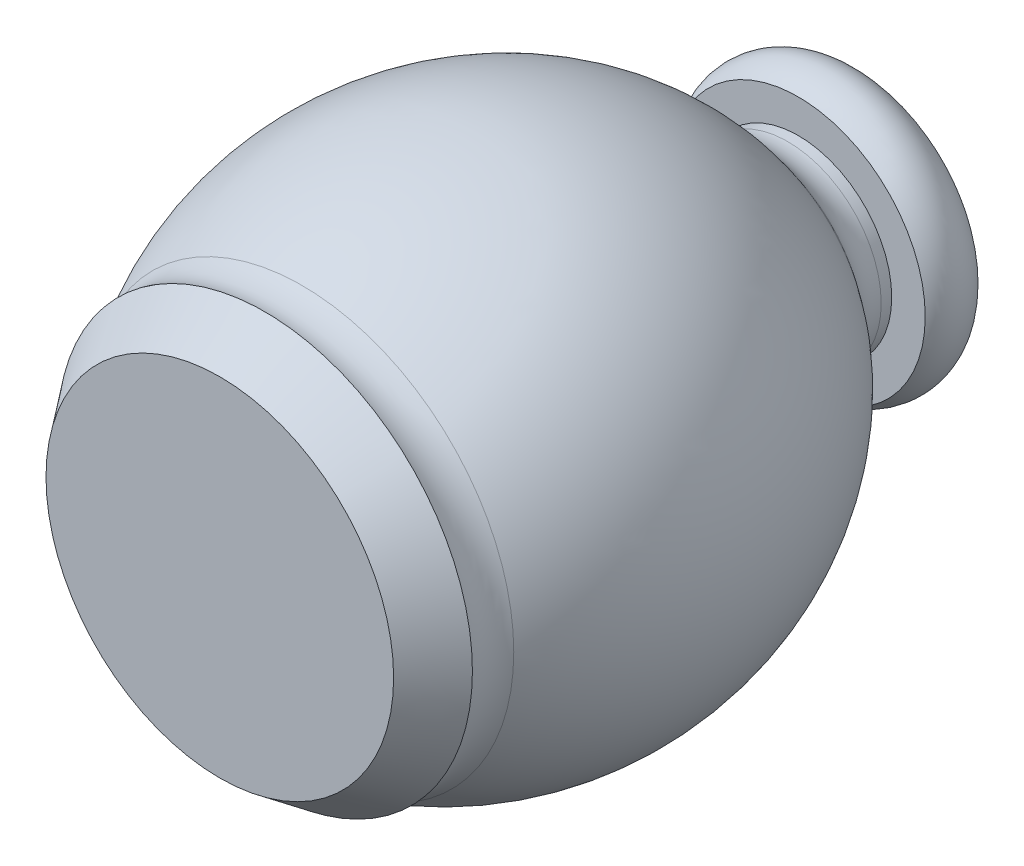
ISO-10303-21;
HEADER;
FILE_DESCRIPTION(('STEP AP214'),'2;1');
FILE_NAME('part.step','',(''),(''),'','','');
FILE_SCHEMA(('AUTOMOTIVE_DESIGN { 1 0 10303 214 1 1 1 1 }'));
ENDSEC;
DATA;
#1=APPLICATION_CONTEXT('core data for automotive mechanical design processes');
#2=APPLICATION_PROTOCOL_DEFINITION('international standard','automotive_design',2000,#1);
#3=PRODUCT_CONTEXT('',#1,'mechanical');
#4=PRODUCT('Part','Part','',(#3));
#5=PRODUCT_RELATED_PRODUCT_CATEGORY('part','',(#4));
#6=PRODUCT_DEFINITION_FORMATION('','',#4);
#7=PRODUCT_DEFINITION_CONTEXT('part definition',#1,'design');
#8=PRODUCT_DEFINITION('design','',#6,#7);
#9=PRODUCT_DEFINITION_SHAPE('','',#8);
#10=(LENGTH_UNIT() NAMED_UNIT(*) SI_UNIT(.MILLI.,.METRE.));
#11=(NAMED_UNIT(*) PLANE_ANGLE_UNIT() SI_UNIT($,.RADIAN.));
#12=(NAMED_UNIT(*) SI_UNIT($,.STERADIAN.) SOLID_ANGLE_UNIT());
#13=UNCERTAINTY_MEASURE_WITH_UNIT(LENGTH_MEASURE(1.E-05),#10,'distance_accuracy_value','');
#14=(GEOMETRIC_REPRESENTATION_CONTEXT(3) GLOBAL_UNCERTAINTY_ASSIGNED_CONTEXT((#13)) GLOBAL_UNIT_ASSIGNED_CONTEXT((#10,
#11,#12)) REPRESENTATION_CONTEXT('',''));
#15=CARTESIAN_POINT('',(0.,0.,0.));
#16=DIRECTION('',(0.,0.,1.));
#17=DIRECTION('',(1.,0.,0.));
#18=AXIS2_PLACEMENT_3D('',#15,#16,#17);
#19=CARTESIAN_POINT('',(0.,0.,3.));
#20=DIRECTION('',(0.,0.,-1.));
#21=DIRECTION('',(-1.,0.,0.));
#22=AXIS2_PLACEMENT_3D('',#19,#20,#21);
#23=PLANE('',#22);
#24=CARTESIAN_POINT('',(0.,0.,3.));
#25=DIRECTION('',(0.,0.,1.));
#26=DIRECTION('',(1.,0.,0.));
#27=AXIS2_PLACEMENT_3D('',#24,#25,#26);
#28=CIRCLE('',#27,27.6768988149161);
#29=CARTESIAN_POINT('',(27.6768988149161,0.,3.));
#30=VERTEX_POINT('',#29);
#31=EDGE_CURVE('E10',#30,#30,#28,.T.);
#32=ORIENTED_EDGE('',*,*,#31,.T.);
#33=EDGE_LOOP('',(#32));
#34=FACE_BOUND('',#33,.T.);
#35=ADVANCED_FACE('F40',(#34),#23,.F.);
#36=CARTESIAN_POINT('',(0.,0.,-4.17951570845209));
#37=DIRECTION('',(0.,0.,-1.));
#38=DIRECTION('',(-1.,0.,0.));
#39=AXIS2_PLACEMENT_3D('',#36,#37,#38);
#40=CONICAL_SURFACE('',#39,33.0441095872541,0.641945900093793);
#41=ORIENTED_EDGE('',*,*,#31,.F.);
#42=EDGE_LOOP('',(#41));
#43=FACE_BOUND('',#42,.T.);
#44=CARTESIAN_POINT('',(0.,0.,-4.17951570845209));
#45=DIRECTION('',(0.,0.,1.));
#46=DIRECTION('',(1.,0.,0.));
#47=AXIS2_PLACEMENT_3D('',#44,#45,#46);
#48=CIRCLE('',#47,33.0441095872541);
#49=CARTESIAN_POINT('',(33.0441095872541,0.,-4.17951570845209));
#50=VERTEX_POINT('',#49);
#51=EDGE_CURVE('E43',#50,#50,#48,.T.);
#52=ORIENTED_EDGE('',*,*,#51,.T.);
#53=EDGE_LOOP('',(#52));
#54=FACE_BOUND('',#53,.T.);
#55=ADVANCED_FACE('F119',(#43,#54),#40,.T.);
#56=CARTESIAN_POINT('',(0.,0.,-6.44152268149266));
#57=DIRECTION('',(0.,0.,1.));
#58=DIRECTION('',(1.,0.,0.));
#59=AXIS2_PLACEMENT_3D('',#56,#57,#58);
#60=TOROIDAL_SURFACE('',#59,39.66855857973,7.);
#61=ORIENTED_EDGE('',*,*,#51,.F.);
#62=EDGE_LOOP('',(#61));
#63=FACE_BOUND('',#62,.T.);
#64=CARTESIAN_POINT('',(0.,0.,-10.103549391567));
#65=DIRECTION('',(0.,0.,1.));
#66=DIRECTION('',(1.,0.,0.));
#67=AXIS2_PLACEMENT_3D('',#64,#65,#66);
#68=CIRCLE('',#67,33.702859930393);
#69=CARTESIAN_POINT('',(33.702859930393,0.,-10.103549391567));
#70=VERTEX_POINT('',#69);
#71=EDGE_CURVE('E50',#70,#70,#68,.T.);
#72=ORIENTED_EDGE('',*,*,#71,.T.);
#73=EDGE_LOOP('',(#72));
#74=FACE_BOUND('',#73,.T.);
#75=ADVANCED_FACE('F123',(#63,#74),#60,.F.);
#76=CARTESIAN_POINT('',(0.,0.,-37.656976744186));
#77=DIRECTION('',(0.,0.,1.));
#78=DIRECTION('',(1.,0.,0.));
#79=AXIS2_PLACEMENT_3D('',#76,#77,#78);
#80=DEGENERATE_TOROIDAL_SURFACE('',#79,11.1836079618059,52.668646828198,.F.);
#81=ORIENTED_EDGE('',*,*,#71,.F.);
#82=EDGE_LOOP('',(#81));
#83=FACE_BOUND('',#82,.T.);
#84=CARTESIAN_POINT('',(0.,0.,-79.840989674269));
#85=DIRECTION('',(0.,0.,1.));
#86=DIRECTION('',(1.,0.,0.));
#87=AXIS2_PLACEMENT_3D('',#84,#85,#86);
#88=CIRCLE('',#87,20.3520133548583);
#89=CARTESIAN_POINT('',(20.3520133548583,0.,-79.840989674269));
#90=VERTEX_POINT('',#89);
#91=EDGE_CURVE('E51',#90,#90,#88,.T.);
#92=ORIENTED_EDGE('',*,*,#91,.T.);
#93=EDGE_LOOP('',(#92));
#94=FACE_BOUND('',#93,.T.);
#95=ADVANCED_FACE('F128',(#83,#94),#80,.F.);
#96=CARTESIAN_POINT('',(0.,0.,-81.835114974885));
#97=DIRECTION('',(0.,0.,1.));
#98=DIRECTION('',(1.,0.,0.));
#99=AXIS2_PLACEMENT_3D('',#96,#97,#98);
#100=CONICAL_SURFACE('',#99,17.6845470436447,0.928850426701103);
#101=ORIENTED_EDGE('',*,*,#91,.F.);
#102=EDGE_LOOP('',(#101));
#103=FACE_BOUND('',#102,.T.);
#104=CARTESIAN_POINT('',(0.,0.,-81.835114974885));
#105=DIRECTION('',(0.,0.,1.));
#106=DIRECTION('',(1.,0.,0.));
#107=AXIS2_PLACEMENT_3D('',#104,#105,#106);
#108=CIRCLE('',#107,17.6845470436447);
#109=CARTESIAN_POINT('',(17.6845470436447,0.,-81.835114974885));
#110=VERTEX_POINT('',#109);
#111=EDGE_CURVE('E57',#110,#110,#108,.T.);
#112=ORIENTED_EDGE('',*,*,#111,.T.);
#113=EDGE_LOOP('',(#112));
#114=FACE_BOUND('',#113,.T.);
#115=ADVANCED_FACE('F135',(#103,#114),#100,.T.);
#116=CARTESIAN_POINT('',(0.,0.,-87.4416400765037));
#117=DIRECTION('',(0.,0.,1.));
#118=DIRECTION('',(1.,0.,0.));
#119=AXIS2_PLACEMENT_3D('',#116,#117,#118);
#120=TOROIDAL_SURFACE('',#119,21.8758327992237,7.);
#121=ORIENTED_EDGE('',*,*,#111,.F.);
#122=EDGE_LOOP('',(#121));
#123=FACE_BOUND('',#122,.T.);
#124=CARTESIAN_POINT('',(0.,0.,-87.4416400765037));
#125=DIRECTION('',(0.,0.,1.));
#126=DIRECTION('',(1.,0.,0.));
#127=AXIS2_PLACEMENT_3D('',#124,#125,#126);
#128=CIRCLE('',#127,14.8758327992237);
#129=CARTESIAN_POINT('',(14.8758327992237,0.,-87.4416400765037));
#130=VERTEX_POINT('',#129);
#131=EDGE_CURVE('E56',#130,#130,#128,.T.);
#132=ORIENTED_EDGE('',*,*,#131,.T.);
#133=EDGE_LOOP('',(#132));
#134=FACE_BOUND('',#133,.T.);
#135=ADVANCED_FACE('F136',(#123,#134),#120,.F.);
#136=CARTESIAN_POINT('',(0.,0.,0.));
#137=DIRECTION('',(0.,0.,1.));
#138=DIRECTION('',(1.,0.,0.));
#139=AXIS2_PLACEMENT_3D('',#136,#137,#138);
#140=CYLINDRICAL_SURFACE('',#139,14.8758327992237);
#141=ORIENTED_EDGE('',*,*,#131,.F.);
#142=EDGE_LOOP('',(#141));
#143=FACE_BOUND('',#142,.T.);
#144=CARTESIAN_POINT('',(0.,0.,-89.1147582449976));
#145=DIRECTION('',(0.,0.,1.));
#146=DIRECTION('',(1.,0.,0.));
#147=AXIS2_PLACEMENT_3D('',#144,#145,#146);
#148=CIRCLE('',#147,14.8758327992237);
#149=CARTESIAN_POINT('',(14.8758327992237,0.,-89.1147582449976));
#150=VERTEX_POINT('',#149);
#151=EDGE_CURVE('E64',#150,#150,#148,.T.);
#152=ORIENTED_EDGE('',*,*,#151,.T.);
#153=EDGE_LOOP('',(#152));
#154=FACE_BOUND('',#153,.T.);
#155=ADVANCED_FACE('F139',(#143,#154),#140,.T.);
#156=CARTESIAN_POINT('',(-14.8758327992237,0.,-89.1147582449976));
#157=DIRECTION('',(0.,0.,-1.));
#158=DIRECTION('',(-1.,0.,0.));
#159=AXIS2_PLACEMENT_3D('',#156,#157,#158);
#160=PLANE('',#159);
#161=ORIENTED_EDGE('',*,*,#151,.F.);
#162=EDGE_LOOP('',(#161));
#163=FACE_BOUND('',#162,.T.);
#164=CARTESIAN_POINT('',(0.,0.,-89.1147582449976));
#165=DIRECTION('',(0.,0.,1.));
#166=DIRECTION('',(1.,0.,0.));
#167=AXIS2_PLACEMENT_3D('',#164,#165,#166);
#168=CIRCLE('',#167,20.2103123042954);
#169=CARTESIAN_POINT('',(20.2103123042954,0.,-89.1147582449976));
#170=VERTEX_POINT('',#169);
#171=EDGE_CURVE('E63',#170,#170,#168,.T.);
#172=ORIENTED_EDGE('',*,*,#171,.T.);
#173=EDGE_LOOP('',(#172));
#174=FACE_BOUND('',#173,.T.);
#175=ADVANCED_FACE('F143',(#163,#174),#160,.F.);
#176=CARTESIAN_POINT('',(0.,0.,-93.3080900236724));
#177=DIRECTION('',(0.,0.,1.));
#178=DIRECTION('',(1.,0.,0.));
#179=AXIS2_PLACEMENT_3D('',#176,#177,#178);
#180=TOROIDAL_SURFACE('',#179,15.3578252171053,6.41331913578219);
#181=ORIENTED_EDGE('',*,*,#171,.F.);
#182=EDGE_LOOP('',(#181));
#183=FACE_BOUND('',#182,.T.);
#184=CARTESIAN_POINT('',(0.,0.,-99.506012284876));
#185=DIRECTION('',(0.,0.,1.));
#186=DIRECTION('',(1.,0.,0.));
#187=AXIS2_PLACEMENT_3D('',#184,#185,#186);
#188=CIRCLE('',#187,17.0059823641839);
#189=CARTESIAN_POINT('',(17.0059823641839,0.,-99.506012284876));
#190=VERTEX_POINT('',#189);
#191=EDGE_CURVE('E66',#190,#190,#188,.T.);
#192=ORIENTED_EDGE('',*,*,#191,.T.);
#193=EDGE_LOOP('',(#192));
#194=FACE_BOUND('',#193,.T.);
#195=ADVANCED_FACE('F149',(#183,#194),#180,.T.);
#196=CARTESIAN_POINT('',(-17.0059823641839,0.,-99.506012284876));
#197=DIRECTION('',(0.,0.,1.));
#198=DIRECTION('',(1.,0.,0.));
#199=AXIS2_PLACEMENT_3D('',#196,#197,#198);
#200=PLANE('',#199);
#201=ORIENTED_EDGE('',*,*,#191,.F.);
#202=EDGE_LOOP('',(#201));
#203=FACE_BOUND('',#202,.T.);
#204=CARTESIAN_POINT('',(0.,0.,-99.506012284876));
#205=DIRECTION('',(0.,0.,1.));
#206=DIRECTION('',(1.,0.,0.));
#207=AXIS2_PLACEMENT_3D('',#204,#205,#206);
#208=CIRCLE('',#207,11.8758327992237);
#209=CARTESIAN_POINT('',(11.8758327992237,0.,-99.506012284876));
#210=VERTEX_POINT('',#209);
#211=EDGE_CURVE('E72',#210,#210,#208,.T.);
#212=ORIENTED_EDGE('',*,*,#211,.T.);
#213=EDGE_LOOP('',(#212));
#214=FACE_BOUND('',#213,.T.);
#215=ADVANCED_FACE('F154',(#203,#214),#200,.F.);
#216=CARTESIAN_POINT('',(0.,0.,0.));
#217=DIRECTION('',(0.,0.,1.));
#218=DIRECTION('',(1.,0.,0.));
#219=AXIS2_PLACEMENT_3D('',#216,#217,#218);
#220=CYLINDRICAL_SURFACE('',#219,11.8758327992237);
#221=ORIENTED_EDGE('',*,*,#211,.F.);
#222=EDGE_LOOP('',(#221));
#223=FACE_BOUND('',#222,.T.);
#224=CARTESIAN_POINT('',(0.,0.,-96.506012284876));
#225=DIRECTION('',(0.,0.,1.));
#226=DIRECTION('',(1.,0.,0.));
#227=AXIS2_PLACEMENT_3D('',#224,#225,#226);
#228=CIRCLE('',#227,11.8758327992237);
#229=CARTESIAN_POINT('',(11.8758327992237,0.,-96.506012284876));
#230=VERTEX_POINT('',#229);
#231=EDGE_CURVE('E71',#230,#230,#228,.T.);
#232=ORIENTED_EDGE('',*,*,#231,.T.);
#233=EDGE_LOOP('',(#232));
#234=FACE_BOUND('',#233,.T.);
#235=ADVANCED_FACE('F157',(#223,#234),#220,.F.);
#236=CARTESIAN_POINT('',(-16.55115699578,0.,-96.506012284876));
#237=DIRECTION('',(0.,0.,-1.));
#238=DIRECTION('',(-1.,0.,0.));
#239=AXIS2_PLACEMENT_3D('',#236,#237,#238);
#240=PLANE('',#239);
#241=ORIENTED_EDGE('',*,*,#231,.F.);
#242=EDGE_LOOP('',(#241));
#243=FACE_BOUND('',#242,.T.);
#244=CARTESIAN_POINT('',(0.,0.,-96.506012284876));
#245=DIRECTION('',(0.,0.,1.));
#246=DIRECTION('',(1.,0.,0.));
#247=AXIS2_PLACEMENT_3D('',#244,#245,#246);
#248=CIRCLE('',#247,16.55115699578);
#249=CARTESIAN_POINT('',(16.55115699578,0.,-96.506012284876));
#250=VERTEX_POINT('',#249);
#251=EDGE_CURVE('E77',#250,#250,#248,.T.);
#252=ORIENTED_EDGE('',*,*,#251,.T.);
#253=EDGE_LOOP('',(#252));
#254=FACE_BOUND('',#253,.T.);
#255=ADVANCED_FACE('F158',(#243,#254),#240,.F.);
#256=CARTESIAN_POINT('',(0.,0.,-93.3080900236724));
#257=DIRECTION('',(0.,0.,1.));
#258=DIRECTION('',(1.,0.,0.));
#259=AXIS2_PLACEMENT_3D('',#256,#257,#258);
#260=TOROIDAL_SURFACE('',#259,15.3578252171053,3.41331913578219);
#261=ORIENTED_EDGE('',*,*,#251,.F.);
#262=EDGE_LOOP('',(#261));
#263=FACE_BOUND('',#262,.T.);
#264=CARTESIAN_POINT('',(0.,0.,-92.1147582449976));
#265=DIRECTION('',(0.,0.,1.));
#266=DIRECTION('',(1.,0.,0.));
#267=AXIS2_PLACEMENT_3D('',#264,#265,#266);
#268=CIRCLE('',#267,18.555747478309);
#269=CARTESIAN_POINT('',(18.555747478309,0.,-92.1147582449976));
#270=VERTEX_POINT('',#269);
#271=EDGE_CURVE('E79',#270,#270,#268,.T.);
#272=ORIENTED_EDGE('',*,*,#271,.T.);
#273=EDGE_LOOP('',(#272));
#274=FACE_BOUND('',#273,.T.);
#275=ADVANCED_FACE('F161',(#263,#274),#260,.F.);
#276=CARTESIAN_POINT('',(-11.8758327992237,0.,-92.1147582449976));
#277=DIRECTION('',(0.,0.,1.));
#278=DIRECTION('',(1.,0.,0.));
#279=AXIS2_PLACEMENT_3D('',#276,#277,#278);
#280=PLANE('',#279);
#281=ORIENTED_EDGE('',*,*,#271,.F.);
#282=EDGE_LOOP('',(#281));
#283=FACE_BOUND('',#282,.T.);
#284=CARTESIAN_POINT('',(0.,0.,-92.1147582449976));
#285=DIRECTION('',(0.,0.,1.));
#286=DIRECTION('',(1.,0.,0.));
#287=AXIS2_PLACEMENT_3D('',#284,#285,#286);
#288=CIRCLE('',#287,11.8758327992237);
#289=CARTESIAN_POINT('',(11.8758327992237,0.,-92.1147582449976));
#290=VERTEX_POINT('',#289);
#291=EDGE_CURVE('E81',#290,#290,#288,.T.);
#292=ORIENTED_EDGE('',*,*,#291,.T.);
#293=EDGE_LOOP('',(#292));
#294=FACE_BOUND('',#293,.T.);
#295=ADVANCED_FACE('F166',(#283,#294),#280,.F.);
#296=CARTESIAN_POINT('',(0.,0.,0.));
#297=DIRECTION('',(0.,0.,1.));
#298=DIRECTION('',(1.,0.,0.));
#299=AXIS2_PLACEMENT_3D('',#296,#297,#298);
#300=CYLINDRICAL_SURFACE('',#299,11.8758327992237);
#301=ORIENTED_EDGE('',*,*,#291,.F.);
#302=EDGE_LOOP('',(#301));
#303=FACE_BOUND('',#302,.T.);
#304=CARTESIAN_POINT('',(0.,0.,-87.4416400765037));
#305=DIRECTION('',(0.,0.,1.));
#306=DIRECTION('',(1.,0.,0.));
#307=AXIS2_PLACEMENT_3D('',#304,#305,#306);
#308=CIRCLE('',#307,11.8758327992237);
#309=CARTESIAN_POINT('',(11.8758327992237,0.,-87.4416400765037));
#310=VERTEX_POINT('',#309);
#311=EDGE_CURVE('E86',#310,#310,#308,.T.);
#312=ORIENTED_EDGE('',*,*,#311,.T.);
#313=EDGE_LOOP('',(#312));
#314=FACE_BOUND('',#313,.T.);
#315=ADVANCED_FACE('F175',(#303,#314),#300,.F.);
#316=CARTESIAN_POINT('',(0.,0.,-87.4416400765037));
#317=DIRECTION('',(0.,0.,1.));
#318=DIRECTION('',(1.,0.,0.));
#319=AXIS2_PLACEMENT_3D('',#316,#317,#318);
#320=TOROIDAL_SURFACE('',#319,21.8758327992237,10.);
#321=ORIENTED_EDGE('',*,*,#311,.F.);
#322=EDGE_LOOP('',(#321));
#323=FACE_BOUND('',#322,.T.);
#324=CARTESIAN_POINT('',(0.,0.,-79.4323185027627));
#325=DIRECTION('',(0.,0.,1.));
#326=DIRECTION('',(1.,0.,0.));
#327=AXIS2_PLACEMENT_3D('',#324,#325,#326);
#328=CIRCLE('',#327,15.8882817198251);
#329=CARTESIAN_POINT('',(15.8882817198251,0.,-79.4323185027627));
#330=VERTEX_POINT('',#329);
#331=EDGE_CURVE('E87',#330,#330,#328,.T.);
#332=ORIENTED_EDGE('',*,*,#331,.T.);
#333=EDGE_LOOP('',(#332));
#334=FACE_BOUND('',#333,.T.);
#335=ADVANCED_FACE('F176',(#323,#334),#320,.T.);
#336=CARTESIAN_POINT('',(0.,0.,-77.4381932021467));
#337=DIRECTION('',(0.,0.,1.));
#338=DIRECTION('',(1.,0.,0.));
#339=AXIS2_PLACEMENT_3D('',#336,#337,#338);
#340=CONICAL_SURFACE('',#339,18.5557480310387,0.928850426701106);
#341=ORIENTED_EDGE('',*,*,#331,.F.);
#342=EDGE_LOOP('',(#341));
#343=FACE_BOUND('',#342,.T.);
#344=CARTESIAN_POINT('',(0.,0.,-77.4381932021467));
#345=DIRECTION('',(0.,0.,1.));
#346=DIRECTION('',(1.,0.,0.));
#347=AXIS2_PLACEMENT_3D('',#344,#345,#346);
#348=CIRCLE('',#347,18.5557480310387);
#349=CARTESIAN_POINT('',(18.5557480310387,0.,-77.4381932021467));
#350=VERTEX_POINT('',#349);
#351=EDGE_CURVE('E95',#350,#350,#348,.T.);
#352=ORIENTED_EDGE('',*,*,#351,.T.);
#353=EDGE_LOOP('',(#352));
#354=FACE_BOUND('',#353,.T.);
#355=ADVANCED_FACE('F179',(#343,#354),#340,.F.);
#356=CARTESIAN_POINT('',(0.,0.,-37.656976744186));
#357=DIRECTION('',(0.,0.,1.));
#358=DIRECTION('',(1.,0.,0.));
#359=AXIS2_PLACEMENT_3D('',#356,#357,#358);
#360=DEGENERATE_TOROIDAL_SURFACE('',#359,11.1836079618059,49.668646828198,.F.);
#361=ORIENTED_EDGE('',*,*,#351,.F.);
#362=EDGE_LOOP('',(#361));
#363=FACE_BOUND('',#362,.T.);
#364=CARTESIAN_POINT('',(0.,0.,-11.6729894101703));
#365=DIRECTION('',(0.,0.,1.));
#366=DIRECTION('',(1.,0.,0.));
#367=AXIS2_PLACEMENT_3D('',#364,#365,#366);
#368=CIRCLE('',#367,31.1461319378199);
#369=CARTESIAN_POINT('',(31.1461319378199,0.,-11.6729894101703));
#370=VERTEX_POINT('',#369);
#371=EDGE_CURVE('E94',#370,#370,#368,.T.);
#372=ORIENTED_EDGE('',*,*,#371,.T.);
#373=EDGE_LOOP('',(#372));
#374=FACE_BOUND('',#373,.T.);
#375=ADVANCED_FACE('F182',(#363,#374),#360,.T.);
#376=CARTESIAN_POINT('',(0.,0.,-6.44152268149266));
#377=DIRECTION('',(0.,0.,1.));
#378=DIRECTION('',(1.,0.,0.));
#379=AXIS2_PLACEMENT_3D('',#376,#377,#378);
#380=TOROIDAL_SURFACE('',#379,39.66855857973,9.99999999999999);
#381=ORIENTED_EDGE('',*,*,#371,.F.);
#382=EDGE_LOOP('',(#381));
#383=FACE_BOUND('',#382,.T.);
#384=CARTESIAN_POINT('',(0.,0.,-3.21008414857756));
#385=DIRECTION('',(0.,0.,1.));
#386=DIRECTION('',(1.,0.,0.));
#387=AXIS2_PLACEMENT_3D('',#384,#385,#386);
#388=CIRCLE('',#387,30.2050600190501);
#389=CARTESIAN_POINT('',(30.2050600190501,0.,-3.21008414857756));
#390=VERTEX_POINT('',#389);
#391=EDGE_CURVE('E97',#390,#390,#388,.T.);
#392=ORIENTED_EDGE('',*,*,#391,.T.);
#393=EDGE_LOOP('',(#392));
#394=FACE_BOUND('',#393,.T.);
#395=ADVANCED_FACE('F111',(#383,#394),#380,.T.);
#396=CARTESIAN_POINT('',(0.,0.,0.));
#397=DIRECTION('',(0.,0.,-1.));
#398=DIRECTION('',(-1.,0.,0.));
#399=AXIS2_PLACEMENT_3D('',#396,#397,#398);
#400=CONICAL_SURFACE('',#399,27.58851609976,0.683881491331957);
#401=ORIENTED_EDGE('',*,*,#391,.F.);
#402=EDGE_LOOP('',(#401));
#403=FACE_BOUND('',#402,.T.);
#404=CARTESIAN_POINT('',(0.,0.,0.));
#405=DIRECTION('',(0.,0.,1.));
#406=DIRECTION('',(1.,0.,0.));
#407=AXIS2_PLACEMENT_3D('',#404,#405,#406);
#408=CIRCLE('',#407,27.58851609976);
#409=CARTESIAN_POINT('',(27.58851609976,0.,0.));
#410=VERTEX_POINT('',#409);
#411=EDGE_CURVE('E102',#410,#410,#408,.T.);
#412=ORIENTED_EDGE('',*,*,#411,.T.);
#413=EDGE_LOOP('',(#412));
#414=FACE_BOUND('',#413,.T.);
#415=ADVANCED_FACE('F103',(#403,#414),#400,.F.);
#416=CARTESIAN_POINT('',(-27.58851609976,0.,0.));
#417=DIRECTION('',(0.,0.,1.));
#418=DIRECTION('',(1.,0.,0.));
#419=AXIS2_PLACEMENT_3D('',#416,#417,#418);
#420=PLANE('',#419);
#421=ORIENTED_EDGE('',*,*,#411,.F.);
#422=EDGE_LOOP('',(#421));
#423=FACE_BOUND('',#422,.T.);
#424=ADVANCED_FACE('F109',(#423),#420,.F.);
#425=CLOSED_SHELL('',(#35,#55,#75,#95,#115,#135,#155,#175,#195,#215,#235,#255,#275,#295,#315,
#335,#355,#375,#395,#415,#424));
#426=MANIFOLD_SOLID_BREP('B2',#425);
#427=ADVANCED_BREP_SHAPE_REPRESENTATION('',(#18,#426),#14);
#428=SHAPE_DEFINITION_REPRESENTATION(#9,#427);
ENDSEC;
END-ISO-10303-21;
